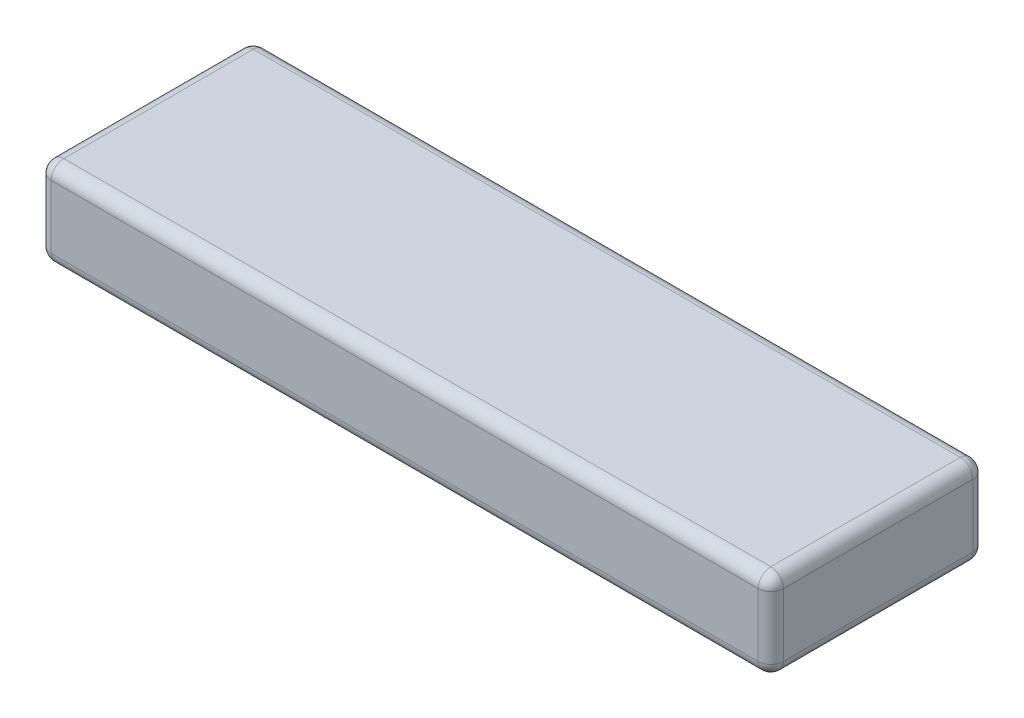
ISO-10303-21;
HEADER;
FILE_DESCRIPTION(('STEP AP214'),'2;1');
FILE_NAME('part.step','',(''),(''),'','','');
FILE_SCHEMA(('AUTOMOTIVE_DESIGN { 1 0 10303 214 1 1 1 1 }'));
ENDSEC;
DATA;
#1=APPLICATION_CONTEXT('core data for automotive mechanical design processes');
#2=APPLICATION_PROTOCOL_DEFINITION('international standard','automotive_design',2000,#1);
#3=PRODUCT_CONTEXT('',#1,'mechanical');
#4=PRODUCT('Part','Part','',(#3));
#5=PRODUCT_RELATED_PRODUCT_CATEGORY('part','',(#4));
#6=PRODUCT_DEFINITION_FORMATION('','',#4);
#7=PRODUCT_DEFINITION_CONTEXT('part definition',#1,'design');
#8=PRODUCT_DEFINITION('design','',#6,#7);
#9=PRODUCT_DEFINITION_SHAPE('','',#8);
#10=(LENGTH_UNIT() NAMED_UNIT(*) SI_UNIT(.MILLI.,.METRE.));
#11=(NAMED_UNIT(*) PLANE_ANGLE_UNIT() SI_UNIT($,.RADIAN.));
#12=(NAMED_UNIT(*) SI_UNIT($,.STERADIAN.) SOLID_ANGLE_UNIT());
#13=UNCERTAINTY_MEASURE_WITH_UNIT(LENGTH_MEASURE(1.E-05),#10,'distance_accuracy_value','');
#14=(GEOMETRIC_REPRESENTATION_CONTEXT(3) GLOBAL_UNCERTAINTY_ASSIGNED_CONTEXT((#13)) GLOBAL_UNIT_ASSIGNED_CONTEXT((#10,
#11,#12)) REPRESENTATION_CONTEXT('',''));
#15=CARTESIAN_POINT('',(0.,0.,0.));
#16=DIRECTION('',(0.,0.,1.));
#17=DIRECTION('',(1.,0.,0.));
#18=AXIS2_PLACEMENT_3D('',#15,#16,#17);
#19=CARTESIAN_POINT('',(0.,14.,0.));
#20=DIRECTION('',(1.,0.,0.));
#21=DIRECTION('',(0.,0.,-1.));
#22=AXIS2_PLACEMENT_3D('',#19,#20,#21);
#23=PLANE('',#22);
#24=DIRECTION('',(0.,0.,1.));
#25=VECTOR('',#24,1.);
#26=CARTESIAN_POINT('',(0.,2.,0.));
#27=LINE('',#26,#25);
#28=CARTESIAN_POINT('',(0.,2.,-32.));
#29=VERTEX_POINT('',#28);
#30=CARTESIAN_POINT('',(0.,2.,-2.));
#31=VERTEX_POINT('',#30);
#32=EDGE_CURVE('E243',#29,#31,#27,.T.);
#33=ORIENTED_EDGE('',*,*,#32,.T.);
#34=DIRECTION('',(0.,-1.,0.));
#35=VECTOR('',#34,1.);
#36=CARTESIAN_POINT('',(0.,14.,-2.));
#37=LINE('',#36,#35);
#38=CARTESIAN_POINT('',(0.,12.,-2.));
#39=VERTEX_POINT('',#38);
#40=EDGE_CURVE('E194',#31,#39,#37,.F.);
#41=ORIENTED_EDGE('',*,*,#40,.T.);
#42=DIRECTION('',(0.,0.,1.));
#43=VECTOR('',#42,1.);
#44=CARTESIAN_POINT('',(0.,12.,0.));
#45=LINE('',#44,#43);
#46=CARTESIAN_POINT('',(0.,12.,-32.));
#47=VERTEX_POINT('',#46);
#48=EDGE_CURVE('E240',#39,#47,#45,.F.);
#49=ORIENTED_EDGE('',*,*,#48,.T.);
#50=DIRECTION('',(0.,-1.,0.));
#51=VECTOR('',#50,1.);
#52=CARTESIAN_POINT('',(0.,14.,-32.));
#53=LINE('',#52,#51);
#54=EDGE_CURVE('E192',#47,#29,#53,.T.);
#55=ORIENTED_EDGE('',*,*,#54,.T.);
#56=EDGE_LOOP('',(#33,#41,#49,#55));
#57=FACE_BOUND('',#56,.T.);
#58=ADVANCED_FACE('F39',(#57),#23,.F.);
#59=CARTESIAN_POINT('',(0.,14.,0.));
#60=DIRECTION('',(0.,0.,-1.));
#61=DIRECTION('',(-1.,0.,0.));
#62=AXIS2_PLACEMENT_3D('',#59,#60,#61);
#63=PLANE('',#62);
#64=DIRECTION('',(1.,0.,0.));
#65=VECTOR('',#64,1.);
#66=CARTESIAN_POINT('',(0.,12.,0.));
#67=LINE('',#66,#65);
#68=CARTESIAN_POINT('',(114.,12.,0.));
#69=VERTEX_POINT('',#68);
#70=CARTESIAN_POINT('',(2.,12.,0.));
#71=VERTEX_POINT('',#70);
#72=EDGE_CURVE('E206',#69,#71,#67,.F.);
#73=ORIENTED_EDGE('',*,*,#72,.T.);
#74=DIRECTION('',(0.,-1.,0.));
#75=VECTOR('',#74,1.);
#76=CARTESIAN_POINT('',(2.,14.,0.));
#77=LINE('',#76,#75);
#78=CARTESIAN_POINT('',(2.,2.,0.));
#79=VERTEX_POINT('',#78);
#80=EDGE_CURVE('E190',#71,#79,#77,.T.);
#81=ORIENTED_EDGE('',*,*,#80,.T.);
#82=DIRECTION('',(1.,0.,0.));
#83=VECTOR('',#82,1.);
#84=CARTESIAN_POINT('',(116.,2.,0.));
#85=LINE('',#84,#83);
#86=CARTESIAN_POINT('',(114.,2.,0.));
#87=VERTEX_POINT('',#86);
#88=EDGE_CURVE('E138',#79,#87,#85,.T.);
#89=ORIENTED_EDGE('',*,*,#88,.T.);
#90=DIRECTION('',(0.,-1.,0.));
#91=VECTOR('',#90,1.);
#92=CARTESIAN_POINT('',(114.,14.,0.));
#93=LINE('',#92,#91);
#94=EDGE_CURVE('E188',#87,#69,#93,.F.);
#95=ORIENTED_EDGE('',*,*,#94,.T.);
#96=EDGE_LOOP('',(#73,#81,#89,#95));
#97=FACE_BOUND('',#96,.T.);
#98=ADVANCED_FACE('F268',(#97),#63,.F.);
#99=CARTESIAN_POINT('',(116.,14.,0.));
#100=DIRECTION('',(-1.,0.,0.));
#101=DIRECTION('',(0.,0.,1.));
#102=AXIS2_PLACEMENT_3D('',#99,#100,#101);
#103=PLANE('',#102);
#104=DIRECTION('',(0.,0.,-1.));
#105=VECTOR('',#104,1.);
#106=CARTESIAN_POINT('',(116.,2.,-34.));
#107=LINE('',#106,#105);
#108=CARTESIAN_POINT('',(116.,2.,-2.));
#109=VERTEX_POINT('',#108);
#110=CARTESIAN_POINT('',(116.,2.,-32.));
#111=VERTEX_POINT('',#110);
#112=EDGE_CURVE('E229',#109,#111,#107,.T.);
#113=ORIENTED_EDGE('',*,*,#112,.T.);
#114=DIRECTION('',(0.,-1.,0.));
#115=VECTOR('',#114,1.);
#116=CARTESIAN_POINT('',(116.,14.,-32.));
#117=LINE('',#116,#115);
#118=CARTESIAN_POINT('',(116.,12.,-32.));
#119=VERTEX_POINT('',#118);
#120=EDGE_CURVE('E11',#111,#119,#117,.F.);
#121=ORIENTED_EDGE('',*,*,#120,.T.);
#122=DIRECTION('',(0.,0.,-1.));
#123=VECTOR('',#122,1.);
#124=CARTESIAN_POINT('',(116.,12.,0.));
#125=LINE('',#124,#123);
#126=CARTESIAN_POINT('',(116.,12.,-2.));
#127=VERTEX_POINT('',#126);
#128=EDGE_CURVE('E162',#119,#127,#125,.F.);
#129=ORIENTED_EDGE('',*,*,#128,.T.);
#130=DIRECTION('',(0.,-1.,0.));
#131=VECTOR('',#130,1.);
#132=CARTESIAN_POINT('',(116.,14.,-2.));
#133=LINE('',#132,#131);
#134=EDGE_CURVE('E48',#127,#109,#133,.T.);
#135=ORIENTED_EDGE('',*,*,#134,.T.);
#136=EDGE_LOOP('',(#113,#121,#129,#135));
#137=FACE_BOUND('',#136,.T.);
#138=ADVANCED_FACE('F308',(#137),#103,.F.);
#139=CARTESIAN_POINT('',(0.,14.,-34.));
#140=DIRECTION('',(0.,0.,1.));
#141=DIRECTION('',(1.,0.,0.));
#142=AXIS2_PLACEMENT_3D('',#139,#140,#141);
#143=PLANE('',#142);
#144=DIRECTION('',(-1.,0.,0.));
#145=VECTOR('',#144,1.);
#146=CARTESIAN_POINT('',(0.,2.,-34.));
#147=LINE('',#146,#145);
#148=CARTESIAN_POINT('',(114.,2.,-34.));
#149=VERTEX_POINT('',#148);
#150=CARTESIAN_POINT('',(2.,2.,-34.));
#151=VERTEX_POINT('',#150);
#152=EDGE_CURVE('E234',#149,#151,#147,.T.);
#153=ORIENTED_EDGE('',*,*,#152,.T.);
#154=DIRECTION('',(0.,-1.,0.));
#155=VECTOR('',#154,1.);
#156=CARTESIAN_POINT('',(2.,14.,-34.));
#157=LINE('',#156,#155);
#158=CARTESIAN_POINT('',(2.,12.,-34.));
#159=VERTEX_POINT('',#158);
#160=EDGE_CURVE('E198',#151,#159,#157,.F.);
#161=ORIENTED_EDGE('',*,*,#160,.T.);
#162=DIRECTION('',(-1.,0.,0.));
#163=VECTOR('',#162,1.);
#164=CARTESIAN_POINT('',(0.,12.,-34.));
#165=LINE('',#164,#163);
#166=CARTESIAN_POINT('',(114.,12.,-34.));
#167=VERTEX_POINT('',#166);
#168=EDGE_CURVE('E231',#159,#167,#165,.F.);
#169=ORIENTED_EDGE('',*,*,#168,.T.);
#170=DIRECTION('',(0.,-1.,0.));
#171=VECTOR('',#170,1.);
#172=CARTESIAN_POINT('',(114.,14.,-34.));
#173=LINE('',#172,#171);
#174=EDGE_CURVE('E196',#167,#149,#173,.T.);
#175=ORIENTED_EDGE('',*,*,#174,.T.);
#176=EDGE_LOOP('',(#153,#161,#169,#175));
#177=FACE_BOUND('',#176,.T.);
#178=ADVANCED_FACE('F291',(#177),#143,.F.);
#179=CARTESIAN_POINT('',(0.,14.,0.));
#180=DIRECTION('',(0.,-1.,0.));
#181=DIRECTION('',(0.,0.,-1.));
#182=AXIS2_PLACEMENT_3D('',#179,#180,#181);
#183=PLANE('',#182);
#184=DIRECTION('',(0.,0.,-1.));
#185=VECTOR('',#184,1.);
#186=CARTESIAN_POINT('',(114.,14.,-3.25719843253998E-13));
#187=LINE('',#186,#185);
#188=CARTESIAN_POINT('',(114.,14.,-2.));
#189=VERTEX_POINT('',#188);
#190=CARTESIAN_POINT('',(114.,14.,-32.));
#191=VERTEX_POINT('',#190);
#192=EDGE_CURVE('E251',#189,#191,#187,.T.);
#193=ORIENTED_EDGE('',*,*,#192,.T.);
#194=DIRECTION('',(-1.,0.,0.));
#195=VECTOR('',#194,1.);
#196=CARTESIAN_POINT('',(0.,14.,-32.));
#197=LINE('',#196,#195);
#198=CARTESIAN_POINT('',(2.,14.,-32.));
#199=VERTEX_POINT('',#198);
#200=EDGE_CURVE('E254',#191,#199,#197,.T.);
#201=ORIENTED_EDGE('',*,*,#200,.T.);
#202=DIRECTION('',(0.,0.,1.));
#203=VECTOR('',#202,1.);
#204=CARTESIAN_POINT('',(2.,14.,0.));
#205=LINE('',#204,#203);
#206=CARTESIAN_POINT('',(2.,14.,-2.));
#207=VERTEX_POINT('',#206);
#208=EDGE_CURVE('E245',#199,#207,#205,.T.);
#209=ORIENTED_EDGE('',*,*,#208,.T.);
#210=DIRECTION('',(1.,0.,0.));
#211=VECTOR('',#210,1.);
#212=CARTESIAN_POINT('',(0.,14.,-2.));
#213=LINE('',#212,#211);
#214=EDGE_CURVE('E248',#207,#189,#213,.T.);
#215=ORIENTED_EDGE('',*,*,#214,.T.);
#216=EDGE_LOOP('',(#193,#201,#209,#215));
#217=FACE_BOUND('',#216,.T.);
#218=ADVANCED_FACE('F317',(#217),#183,.F.);
#219=CARTESIAN_POINT('',(0.,0.,0.));
#220=DIRECTION('',(0.,-1.,0.));
#221=DIRECTION('',(0.,0.,-1.));
#222=AXIS2_PLACEMENT_3D('',#219,#220,#221);
#223=PLANE('',#222);
#224=DIRECTION('',(0.,0.,-1.));
#225=VECTOR('',#224,1.);
#226=CARTESIAN_POINT('',(114.,0.,0.));
#227=LINE('',#226,#225);
#228=CARTESIAN_POINT('',(114.,0.,-32.));
#229=VERTEX_POINT('',#228);
#230=CARTESIAN_POINT('',(114.,0.,-2.));
#231=VERTEX_POINT('',#230);
#232=EDGE_CURVE('E161',#229,#231,#227,.F.);
#233=ORIENTED_EDGE('',*,*,#232,.T.);
#234=DIRECTION('',(1.,0.,0.));
#235=VECTOR('',#234,1.);
#236=CARTESIAN_POINT('',(0.,0.,-2.));
#237=LINE('',#236,#235);
#238=CARTESIAN_POINT('',(2.,0.,-2.));
#239=VERTEX_POINT('',#238);
#240=EDGE_CURVE('E135',#231,#239,#237,.F.);
#241=ORIENTED_EDGE('',*,*,#240,.T.);
#242=DIRECTION('',(0.,0.,1.));
#243=VECTOR('',#242,1.);
#244=CARTESIAN_POINT('',(2.,0.,-34.));
#245=LINE('',#244,#243);
#246=CARTESIAN_POINT('',(2.,0.,-32.));
#247=VERTEX_POINT('',#246);
#248=EDGE_CURVE('E148',#239,#247,#245,.F.);
#249=ORIENTED_EDGE('',*,*,#248,.T.);
#250=DIRECTION('',(-1.,0.,0.));
#251=VECTOR('',#250,1.);
#252=CARTESIAN_POINT('',(116.,0.,-32.));
#253=LINE('',#252,#251);
#254=EDGE_CURVE('E157',#247,#229,#253,.F.);
#255=ORIENTED_EDGE('',*,*,#254,.T.);
#256=EDGE_LOOP('',(#233,#241,#249,#255));
#257=FACE_BOUND('',#256,.T.);
#258=ADVANCED_FACE('F160',(#257),#223,.T.);
#259=CARTESIAN_POINT('',(0.,2.,-32.));
#260=DIRECTION('',(1.,0.,0.));
#261=DIRECTION('',(0.,0.,-1.));
#262=AXIS2_PLACEMENT_3D('',#259,#260,#261);
#263=CYLINDRICAL_SURFACE('',#262,2.);
#264=ORIENTED_EDGE('',*,*,#254,.F.);
#265=CARTESIAN_POINT('',(2.,2.,-32.));
#266=DIRECTION('',(1.,0.,0.));
#267=DIRECTION('',(0.,0.,-1.));
#268=AXIS2_PLACEMENT_3D('',#265,#266,#267);
#269=CIRCLE('',#268,2.);
#270=EDGE_CURVE('E178',#247,#151,#269,.T.);
#271=ORIENTED_EDGE('',*,*,#270,.T.);
#272=ORIENTED_EDGE('',*,*,#152,.F.);
#273=CARTESIAN_POINT('',(114.,2.,-32.));
#274=DIRECTION('',(1.,0.,0.));
#275=DIRECTION('',(0.,0.,-1.));
#276=AXIS2_PLACEMENT_3D('',#273,#274,#275);
#277=CIRCLE('',#276,2.);
#278=EDGE_CURVE('E176',#149,#229,#277,.F.);
#279=ORIENTED_EDGE('',*,*,#278,.T.);
#280=EDGE_LOOP('',(#264,#271,#272,#279));
#281=FACE_BOUND('',#280,.T.);
#282=ADVANCED_FACE('F277',(#281),#263,.T.);
#283=CARTESIAN_POINT('',(2.,2.,0.));
#284=DIRECTION('',(0.,0.,-1.));
#285=DIRECTION('',(-1.,0.,0.));
#286=AXIS2_PLACEMENT_3D('',#283,#284,#285);
#287=CYLINDRICAL_SURFACE('',#286,2.);
#288=ORIENTED_EDGE('',*,*,#248,.F.);
#289=CARTESIAN_POINT('',(2.,2.,-2.));
#290=DIRECTION('',(0.,0.,-1.));
#291=DIRECTION('',(-1.,0.,0.));
#292=AXIS2_PLACEMENT_3D('',#289,#290,#291);
#293=CIRCLE('',#292,2.);
#294=EDGE_CURVE('E151',#239,#31,#293,.T.);
#295=ORIENTED_EDGE('',*,*,#294,.T.);
#296=ORIENTED_EDGE('',*,*,#32,.F.);
#297=CARTESIAN_POINT('',(2.,2.,-32.));
#298=DIRECTION('',(0.,0.,-1.));
#299=DIRECTION('',(-1.,0.,0.));
#300=AXIS2_PLACEMENT_3D('',#297,#298,#299);
#301=CIRCLE('',#300,2.);
#302=EDGE_CURVE('E143',#29,#247,#301,.F.);
#303=ORIENTED_EDGE('',*,*,#302,.T.);
#304=EDGE_LOOP('',(#288,#295,#296,#303));
#305=FACE_BOUND('',#304,.T.);
#306=ADVANCED_FACE('F149',(#305),#287,.T.);
#307=CARTESIAN_POINT('',(114.,2.,0.));
#308=DIRECTION('',(0.,0.,1.));
#309=DIRECTION('',(1.,0.,0.));
#310=AXIS2_PLACEMENT_3D('',#307,#308,#309);
#311=CYLINDRICAL_SURFACE('',#310,2.);
#312=ORIENTED_EDGE('',*,*,#232,.F.);
#313=CARTESIAN_POINT('',(114.,2.,-32.));
#314=DIRECTION('',(0.,0.,1.));
#315=DIRECTION('',(1.,0.,0.));
#316=AXIS2_PLACEMENT_3D('',#313,#314,#315);
#317=CIRCLE('',#316,2.);
#318=EDGE_CURVE('E56',#229,#111,#317,.T.);
#319=ORIENTED_EDGE('',*,*,#318,.T.);
#320=ORIENTED_EDGE('',*,*,#112,.F.);
#321=CARTESIAN_POINT('',(114.,2.,-2.));
#322=DIRECTION('',(0.,0.,1.));
#323=DIRECTION('',(1.,0.,0.));
#324=AXIS2_PLACEMENT_3D('',#321,#322,#323);
#325=CIRCLE('',#324,2.);
#326=EDGE_CURVE('E185',#109,#231,#325,.F.);
#327=ORIENTED_EDGE('',*,*,#326,.T.);
#328=EDGE_LOOP('',(#312,#319,#320,#327));
#329=FACE_BOUND('',#328,.T.);
#330=ADVANCED_FACE('F228',(#329),#311,.T.);
#331=CARTESIAN_POINT('',(0.,2.,-2.));
#332=DIRECTION('',(-1.,0.,0.));
#333=DIRECTION('',(0.,0.,1.));
#334=AXIS2_PLACEMENT_3D('',#331,#332,#333);
#335=CYLINDRICAL_SURFACE('',#334,2.);
#336=ORIENTED_EDGE('',*,*,#88,.F.);
#337=CARTESIAN_POINT('',(2.,2.,-2.));
#338=DIRECTION('',(-1.,0.,0.));
#339=DIRECTION('',(0.,0.,1.));
#340=AXIS2_PLACEMENT_3D('',#337,#338,#339);
#341=CIRCLE('',#340,2.);
#342=EDGE_CURVE('E131',#79,#239,#341,.F.);
#343=ORIENTED_EDGE('',*,*,#342,.T.);
#344=ORIENTED_EDGE('',*,*,#240,.F.);
#345=CARTESIAN_POINT('',(114.,2.,-2.));
#346=DIRECTION('',(-1.,0.,0.));
#347=DIRECTION('',(0.,0.,1.));
#348=AXIS2_PLACEMENT_3D('',#345,#346,#347);
#349=CIRCLE('',#348,2.);
#350=EDGE_CURVE('E144',#231,#87,#349,.T.);
#351=ORIENTED_EDGE('',*,*,#350,.T.);
#352=EDGE_LOOP('',(#336,#343,#344,#351));
#353=FACE_BOUND('',#352,.T.);
#354=ADVANCED_FACE('F133',(#353),#335,.T.);
#355=CARTESIAN_POINT('',(0.,12.,-2.));
#356=DIRECTION('',(1.,0.,0.));
#357=DIRECTION('',(0.,0.,-1.));
#358=AXIS2_PLACEMENT_3D('',#355,#356,#357);
#359=CYLINDRICAL_SURFACE('',#358,2.);
#360=ORIENTED_EDGE('',*,*,#214,.F.);
#361=CARTESIAN_POINT('',(2.,12.,-2.));
#362=DIRECTION('',(1.,0.,0.));
#363=DIRECTION('',(0.,0.,-1.));
#364=AXIS2_PLACEMENT_3D('',#361,#362,#363);
#365=CIRCLE('',#364,2.);
#366=EDGE_CURVE('E264',#207,#71,#365,.T.);
#367=ORIENTED_EDGE('',*,*,#366,.T.);
#368=ORIENTED_EDGE('',*,*,#72,.F.);
#369=CARTESIAN_POINT('',(114.,12.,-2.));
#370=DIRECTION('',(1.,0.,0.));
#371=DIRECTION('',(0.,0.,-1.));
#372=AXIS2_PLACEMENT_3D('',#369,#370,#371);
#373=CIRCLE('',#372,2.);
#374=EDGE_CURVE('E262',#69,#189,#373,.F.);
#375=ORIENTED_EDGE('',*,*,#374,.T.);
#376=EDGE_LOOP('',(#360,#367,#368,#375));
#377=FACE_BOUND('',#376,.T.);
#378=ADVANCED_FACE('F315',(#377),#359,.T.);
#379=CARTESIAN_POINT('',(114.,12.,-3.25719843253998E-13));
#380=DIRECTION('',(0.,0.,-1.));
#381=DIRECTION('',(-1.,0.,0.));
#382=AXIS2_PLACEMENT_3D('',#379,#380,#381);
#383=CYLINDRICAL_SURFACE('',#382,2.);
#384=ORIENTED_EDGE('',*,*,#128,.F.);
#385=CARTESIAN_POINT('',(114.,12.,-32.));
#386=DIRECTION('',(0.,0.,-1.));
#387=DIRECTION('',(-1.,0.,0.));
#388=AXIS2_PLACEMENT_3D('',#385,#386,#387);
#389=CIRCLE('',#388,2.);
#390=EDGE_CURVE('E183',#119,#191,#389,.F.);
#391=ORIENTED_EDGE('',*,*,#390,.T.);
#392=ORIENTED_EDGE('',*,*,#192,.F.);
#393=CARTESIAN_POINT('',(114.,12.,-2.));
#394=DIRECTION('',(0.,0.,-1.));
#395=DIRECTION('',(-1.,0.,0.));
#396=AXIS2_PLACEMENT_3D('',#393,#394,#395);
#397=CIRCLE('',#396,2.);
#398=EDGE_CURVE('E180',#189,#127,#397,.T.);
#399=ORIENTED_EDGE('',*,*,#398,.T.);
#400=EDGE_LOOP('',(#384,#391,#392,#399));
#401=FACE_BOUND('',#400,.T.);
#402=ADVANCED_FACE('F310',(#401),#383,.T.);
#403=CARTESIAN_POINT('',(2.,12.,0.));
#404=DIRECTION('',(0.,0.,1.));
#405=DIRECTION('',(1.,0.,0.));
#406=AXIS2_PLACEMENT_3D('',#403,#404,#405);
#407=CYLINDRICAL_SURFACE('',#406,2.);
#408=ORIENTED_EDGE('',*,*,#48,.F.);
#409=CARTESIAN_POINT('',(2.,12.,-2.));
#410=DIRECTION('',(0.,0.,1.));
#411=DIRECTION('',(1.,0.,0.));
#412=AXIS2_PLACEMENT_3D('',#409,#410,#411);
#413=CIRCLE('',#412,2.);
#414=EDGE_CURVE('E259',#39,#207,#413,.F.);
#415=ORIENTED_EDGE('',*,*,#414,.T.);
#416=ORIENTED_EDGE('',*,*,#208,.F.);
#417=CARTESIAN_POINT('',(2.,12.,-32.));
#418=DIRECTION('',(0.,0.,1.));
#419=DIRECTION('',(1.,0.,0.));
#420=AXIS2_PLACEMENT_3D('',#417,#418,#419);
#421=CIRCLE('',#420,2.);
#422=EDGE_CURVE('E257',#199,#47,#421,.T.);
#423=ORIENTED_EDGE('',*,*,#422,.T.);
#424=EDGE_LOOP('',(#408,#415,#416,#423));
#425=FACE_BOUND('',#424,.T.);
#426=ADVANCED_FACE('F320',(#425),#407,.T.);
#427=CARTESIAN_POINT('',(0.,12.,-32.));
#428=DIRECTION('',(-1.,0.,0.));
#429=DIRECTION('',(0.,0.,1.));
#430=AXIS2_PLACEMENT_3D('',#427,#428,#429);
#431=CYLINDRICAL_SURFACE('',#430,2.);
#432=ORIENTED_EDGE('',*,*,#168,.F.);
#433=CARTESIAN_POINT('',(2.,12.,-32.));
#434=DIRECTION('',(-1.,0.,0.));
#435=DIRECTION('',(0.,0.,1.));
#436=AXIS2_PLACEMENT_3D('',#433,#434,#435);
#437=CIRCLE('',#436,2.);
#438=EDGE_CURVE('E170',#159,#199,#437,.F.);
#439=ORIENTED_EDGE('',*,*,#438,.T.);
#440=ORIENTED_EDGE('',*,*,#200,.F.);
#441=CARTESIAN_POINT('',(114.,12.,-32.));
#442=DIRECTION('',(-1.,0.,0.));
#443=DIRECTION('',(0.,0.,1.));
#444=AXIS2_PLACEMENT_3D('',#441,#442,#443);
#445=CIRCLE('',#444,2.);
#446=EDGE_CURVE('E167',#191,#167,#445,.T.);
#447=ORIENTED_EDGE('',*,*,#446,.T.);
#448=EDGE_LOOP('',(#432,#439,#440,#447));
#449=FACE_BOUND('',#448,.T.);
#450=ADVANCED_FACE('F293',(#449),#431,.T.);
#451=CARTESIAN_POINT('',(2.,2.,-2.));
#452=DIRECTION('',(0.,0.,1.));
#453=DIRECTION('',(1.,0.,0.));
#454=AXIS2_PLACEMENT_3D('',#451,#452,#453);
#455=SPHERICAL_SURFACE('',#454,2.);
#456=ORIENTED_EDGE('',*,*,#294,.F.);
#457=ORIENTED_EDGE('',*,*,#342,.F.);
#458=CARTESIAN_POINT('',(2.,2.,-2.));
#459=DIRECTION('',(0.,1.,0.));
#460=DIRECTION('',(0.,0.,1.));
#461=AXIS2_PLACEMENT_3D('',#458,#459,#460);
#462=CIRCLE('',#461,2.);
#463=EDGE_CURVE('E165',#31,#79,#462,.T.);
#464=ORIENTED_EDGE('',*,*,#463,.F.);
#465=EDGE_LOOP('',(#456,#457,#464));
#466=FACE_BOUND('',#465,.T.);
#467=ADVANCED_FACE('F164',(#466),#455,.T.);
#468=CARTESIAN_POINT('',(2.,14.,-2.));
#469=DIRECTION('',(0.,-1.,0.));
#470=DIRECTION('',(0.,0.,-1.));
#471=AXIS2_PLACEMENT_3D('',#468,#469,#470);
#472=CYLINDRICAL_SURFACE('',#471,2.);
#473=ORIENTED_EDGE('',*,*,#463,.T.);
#474=ORIENTED_EDGE('',*,*,#80,.F.);
#475=CARTESIAN_POINT('',(2.,12.,-2.));
#476=DIRECTION('',(0.,1.,0.));
#477=DIRECTION('',(0.,0.,1.));
#478=AXIS2_PLACEMENT_3D('',#475,#476,#477);
#479=CIRCLE('',#478,2.);
#480=EDGE_CURVE('E201',#39,#71,#479,.T.);
#481=ORIENTED_EDGE('',*,*,#480,.F.);
#482=ORIENTED_EDGE('',*,*,#40,.F.);
#483=EDGE_LOOP('',(#473,#474,#481,#482));
#484=FACE_BOUND('',#483,.T.);
#485=ADVANCED_FACE('F326',(#484),#472,.T.);
#486=CARTESIAN_POINT('',(2.,12.,-2.));
#487=DIRECTION('',(0.,0.,1.));
#488=DIRECTION('',(1.,0.,0.));
#489=AXIS2_PLACEMENT_3D('',#486,#487,#488);
#490=SPHERICAL_SURFACE('',#489,2.);
#491=ORIENTED_EDGE('',*,*,#480,.T.);
#492=ORIENTED_EDGE('',*,*,#366,.F.);
#493=ORIENTED_EDGE('',*,*,#414,.F.);
#494=EDGE_LOOP('',(#491,#492,#493));
#495=FACE_BOUND('',#494,.T.);
#496=ADVANCED_FACE('F324',(#495),#490,.T.);
#497=CARTESIAN_POINT('',(2.,2.,-32.));
#498=DIRECTION('',(0.,0.,1.));
#499=DIRECTION('',(1.,0.,0.));
#500=AXIS2_PLACEMENT_3D('',#497,#498,#499);
#501=SPHERICAL_SURFACE('',#500,2.);
#502=ORIENTED_EDGE('',*,*,#270,.F.);
#503=ORIENTED_EDGE('',*,*,#302,.F.);
#504=CARTESIAN_POINT('',(2.,2.,-32.));
#505=DIRECTION('',(0.,1.,0.));
#506=DIRECTION('',(0.,0.,1.));
#507=AXIS2_PLACEMENT_3D('',#504,#505,#506);
#508=CIRCLE('',#507,2.);
#509=EDGE_CURVE('E204',#151,#29,#508,.T.);
#510=ORIENTED_EDGE('',*,*,#509,.F.);
#511=EDGE_LOOP('',(#502,#503,#510));
#512=FACE_BOUND('',#511,.T.);
#513=ADVANCED_FACE('F282',(#512),#501,.T.);
#514=CARTESIAN_POINT('',(2.,14.,-32.));
#515=DIRECTION('',(0.,-1.,0.));
#516=DIRECTION('',(0.,0.,-1.));
#517=AXIS2_PLACEMENT_3D('',#514,#515,#516);
#518=CYLINDRICAL_SURFACE('',#517,2.);
#519=ORIENTED_EDGE('',*,*,#509,.T.);
#520=ORIENTED_EDGE('',*,*,#54,.F.);
#521=CARTESIAN_POINT('',(2.,12.,-32.));
#522=DIRECTION('',(0.,1.,0.));
#523=DIRECTION('',(0.,0.,1.));
#524=AXIS2_PLACEMENT_3D('',#521,#522,#523);
#525=CIRCLE('',#524,2.);
#526=EDGE_CURVE('E207',#159,#47,#525,.T.);
#527=ORIENTED_EDGE('',*,*,#526,.F.);
#528=ORIENTED_EDGE('',*,*,#160,.F.);
#529=EDGE_LOOP('',(#519,#520,#527,#528));
#530=FACE_BOUND('',#529,.T.);
#531=ADVANCED_FACE('F287',(#530),#518,.T.);
#532=CARTESIAN_POINT('',(2.,12.,-32.));
#533=DIRECTION('',(0.,0.,1.));
#534=DIRECTION('',(1.,0.,0.));
#535=AXIS2_PLACEMENT_3D('',#532,#533,#534);
#536=SPHERICAL_SURFACE('',#535,2.);
#537=ORIENTED_EDGE('',*,*,#526,.T.);
#538=ORIENTED_EDGE('',*,*,#422,.F.);
#539=ORIENTED_EDGE('',*,*,#438,.F.);
#540=EDGE_LOOP('',(#537,#538,#539));
#541=FACE_BOUND('',#540,.T.);
#542=ADVANCED_FACE('F329',(#541),#536,.T.);
#543=CARTESIAN_POINT('',(114.,2.,-32.));
#544=DIRECTION('',(0.,0.,1.));
#545=DIRECTION('',(1.,0.,0.));
#546=AXIS2_PLACEMENT_3D('',#543,#544,#545);
#547=SPHERICAL_SURFACE('',#546,2.);
#548=ORIENTED_EDGE('',*,*,#318,.F.);
#549=ORIENTED_EDGE('',*,*,#278,.F.);
#550=CARTESIAN_POINT('',(114.,2.,-32.));
#551=DIRECTION('',(0.,1.,0.));
#552=DIRECTION('',(0.,0.,1.));
#553=AXIS2_PLACEMENT_3D('',#550,#551,#552);
#554=CIRCLE('',#553,2.);
#555=EDGE_CURVE('E210',#111,#149,#554,.T.);
#556=ORIENTED_EDGE('',*,*,#555,.F.);
#557=EDGE_LOOP('',(#548,#549,#556));
#558=FACE_BOUND('',#557,.T.);
#559=ADVANCED_FACE('F306',(#558),#547,.T.);
#560=CARTESIAN_POINT('',(114.,14.,-32.));
#561=DIRECTION('',(0.,-1.,0.));
#562=DIRECTION('',(0.,0.,-1.));
#563=AXIS2_PLACEMENT_3D('',#560,#561,#562);
#564=CYLINDRICAL_SURFACE('',#563,2.);
#565=ORIENTED_EDGE('',*,*,#555,.T.);
#566=ORIENTED_EDGE('',*,*,#174,.F.);
#567=CARTESIAN_POINT('',(114.,12.,-32.));
#568=DIRECTION('',(0.,1.,0.));
#569=DIRECTION('',(0.,0.,1.));
#570=AXIS2_PLACEMENT_3D('',#567,#568,#569);
#571=CIRCLE('',#570,2.);
#572=EDGE_CURVE('E213',#119,#167,#571,.T.);
#573=ORIENTED_EDGE('',*,*,#572,.F.);
#574=ORIENTED_EDGE('',*,*,#120,.F.);
#575=EDGE_LOOP('',(#565,#566,#573,#574));
#576=FACE_BOUND('',#575,.T.);
#577=ADVANCED_FACE('F304',(#576),#564,.T.);
#578=CARTESIAN_POINT('',(114.,12.,-32.));
#579=DIRECTION('',(0.,0.,1.));
#580=DIRECTION('',(1.,0.,0.));
#581=AXIS2_PLACEMENT_3D('',#578,#579,#580);
#582=SPHERICAL_SURFACE('',#581,2.);
#583=ORIENTED_EDGE('',*,*,#446,.F.);
#584=ORIENTED_EDGE('',*,*,#390,.F.);
#585=ORIENTED_EDGE('',*,*,#572,.T.);
#586=EDGE_LOOP('',(#583,#584,#585));
#587=FACE_BOUND('',#586,.T.);
#588=ADVANCED_FACE('F299',(#587),#582,.T.);
#589=CARTESIAN_POINT('',(114.,2.,-2.));
#590=DIRECTION('',(0.,0.,1.));
#591=DIRECTION('',(1.,0.,0.));
#592=AXIS2_PLACEMENT_3D('',#589,#590,#591);
#593=SPHERICAL_SURFACE('',#592,2.);
#594=ORIENTED_EDGE('',*,*,#350,.F.);
#595=ORIENTED_EDGE('',*,*,#326,.F.);
#596=CARTESIAN_POINT('',(114.,2.,-2.));
#597=DIRECTION('',(0.,1.,0.));
#598=DIRECTION('',(0.,0.,1.));
#599=AXIS2_PLACEMENT_3D('',#596,#597,#598);
#600=CIRCLE('',#599,2.);
#601=EDGE_CURVE('E43',#87,#109,#600,.T.);
#602=ORIENTED_EDGE('',*,*,#601,.F.);
#603=EDGE_LOOP('',(#594,#595,#602));
#604=FACE_BOUND('',#603,.T.);
#605=ADVANCED_FACE('F41',(#604),#593,.T.);
#606=CARTESIAN_POINT('',(114.,14.,-2.));
#607=DIRECTION('',(0.,-1.,0.));
#608=DIRECTION('',(0.,0.,-1.));
#609=AXIS2_PLACEMENT_3D('',#606,#607,#608);
#610=CYLINDRICAL_SURFACE('',#609,2.);
#611=ORIENTED_EDGE('',*,*,#601,.T.);
#612=ORIENTED_EDGE('',*,*,#134,.F.);
#613=CARTESIAN_POINT('',(114.,12.,-2.));
#614=DIRECTION('',(0.,1.,0.));
#615=DIRECTION('',(0.,0.,1.));
#616=AXIS2_PLACEMENT_3D('',#613,#614,#615);
#617=CIRCLE('',#616,2.);
#618=EDGE_CURVE('E216',#69,#127,#617,.T.);
#619=ORIENTED_EDGE('',*,*,#618,.F.);
#620=ORIENTED_EDGE('',*,*,#94,.F.);
#621=EDGE_LOOP('',(#611,#612,#619,#620));
#622=FACE_BOUND('',#621,.T.);
#623=ADVANCED_FACE('F225',(#622),#610,.T.);
#624=CARTESIAN_POINT('',(114.,12.,-2.));
#625=DIRECTION('',(0.,0.,1.));
#626=DIRECTION('',(1.,0.,0.));
#627=AXIS2_PLACEMENT_3D('',#624,#625,#626);
#628=SPHERICAL_SURFACE('',#627,2.);
#629=ORIENTED_EDGE('',*,*,#398,.F.);
#630=ORIENTED_EDGE('',*,*,#374,.F.);
#631=ORIENTED_EDGE('',*,*,#618,.T.);
#632=EDGE_LOOP('',(#629,#630,#631));
#633=FACE_BOUND('',#632,.T.);
#634=ADVANCED_FACE('F312',(#633),#628,.T.);
#635=CLOSED_SHELL('',(#58,#98,#138,#178,#218,#258,#282,#306,#330,#354,#378,#402,#426,#450,#467,
#485,#496,#513,#531,#542,#559,#577,#588,#605,#623,#634));
#636=MANIFOLD_SOLID_BREP('B2',#635);
#637=ADVANCED_BREP_SHAPE_REPRESENTATION('',(#18,#636),#14);
#638=SHAPE_DEFINITION_REPRESENTATION(#9,#637);
ENDSEC;
END-ISO-10303-21;
